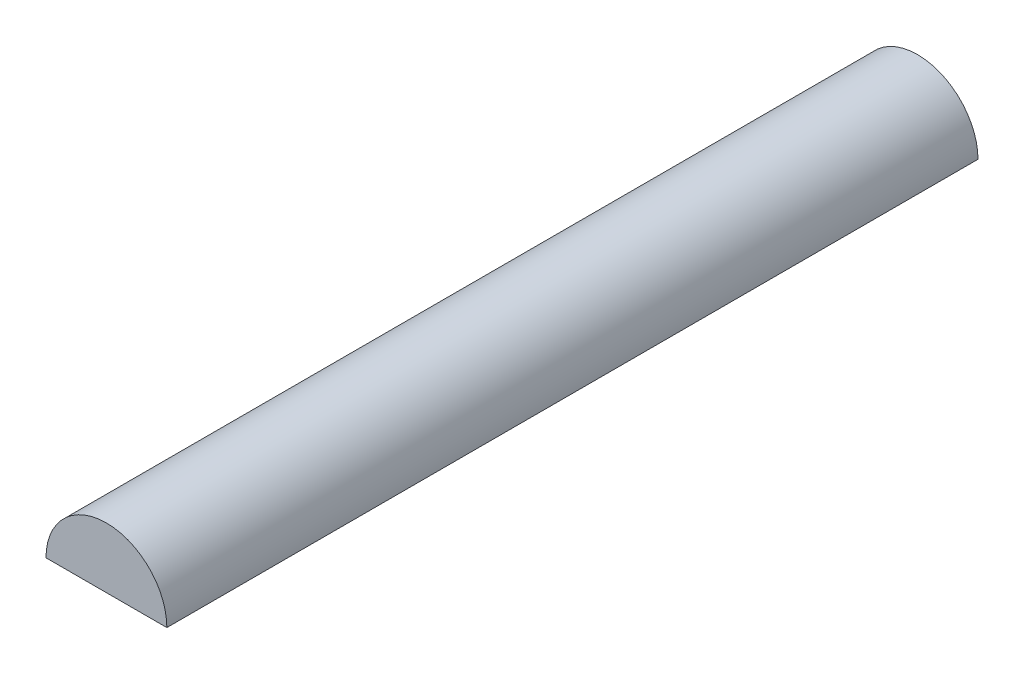
ISO-10303-21;
HEADER;
FILE_DESCRIPTION(('STEP AP214'),'2;1');
FILE_NAME('part.step','',(''),(''),'','','');
FILE_SCHEMA(('AUTOMOTIVE_DESIGN { 1 0 10303 214 1 1 1 1 }'));
ENDSEC;
DATA;
#1=APPLICATION_CONTEXT('core data for automotive mechanical design processes');
#2=APPLICATION_PROTOCOL_DEFINITION('international standard','automotive_design',2000,#1);
#3=PRODUCT_CONTEXT('',#1,'mechanical');
#4=PRODUCT('Part','Part','',(#3));
#5=PRODUCT_RELATED_PRODUCT_CATEGORY('part','',(#4));
#6=PRODUCT_DEFINITION_FORMATION('','',#4);
#7=PRODUCT_DEFINITION_CONTEXT('part definition',#1,'design');
#8=PRODUCT_DEFINITION('design','',#6,#7);
#9=PRODUCT_DEFINITION_SHAPE('','',#8);
#10=(LENGTH_UNIT() NAMED_UNIT(*) SI_UNIT(.MILLI.,.METRE.));
#11=(NAMED_UNIT(*) PLANE_ANGLE_UNIT() SI_UNIT($,.RADIAN.));
#12=(NAMED_UNIT(*) SI_UNIT($,.STERADIAN.) SOLID_ANGLE_UNIT());
#13=UNCERTAINTY_MEASURE_WITH_UNIT(LENGTH_MEASURE(1.E-05),#10,'distance_accuracy_value','');
#14=(GEOMETRIC_REPRESENTATION_CONTEXT(3) GLOBAL_UNCERTAINTY_ASSIGNED_CONTEXT((#13)) GLOBAL_UNIT_ASSIGNED_CONTEXT((#10,
#11,#12)) REPRESENTATION_CONTEXT('',''));
#15=CARTESIAN_POINT('',(0.,0.,0.));
#16=DIRECTION('',(0.,0.,1.));
#17=DIRECTION('',(1.,0.,0.));
#18=AXIS2_PLACEMENT_3D('',#15,#16,#17);
#19=CARTESIAN_POINT('',(0.,0.,10.));
#20=DIRECTION('',(0.,0.,-1.));
#21=DIRECTION('',(-1.,0.,0.));
#22=AXIS2_PLACEMENT_3D('',#19,#20,#21);
#23=CYLINDRICAL_SURFACE('',#22,0.744999999999999);
#24=CARTESIAN_POINT('',(0.,0.,0.));
#25=DIRECTION('',(0.,0.,1.));
#26=DIRECTION('',(-1.,0.,0.));
#27=AXIS2_PLACEMENT_3D('',#24,#25,#26);
#28=CIRCLE('',#27,0.744999999999999);
#29=CARTESIAN_POINT('',(0.744999999999999,0.,0.));
#30=VERTEX_POINT('',#29);
#31=CARTESIAN_POINT('',(-0.744999999999999,0.,0.));
#32=VERTEX_POINT('',#31);
#33=EDGE_CURVE('E69',#30,#32,#28,.T.);
#34=ORIENTED_EDGE('',*,*,#33,.T.);
#35=DIRECTION('',(0.,0.,-1.));
#36=VECTOR('',#35,1.);
#37=CARTESIAN_POINT('',(-0.744999999999999,0.,10.));
#38=LINE('',#37,#36);
#39=CARTESIAN_POINT('',(-0.744999999999999,0.,10.));
#40=VERTEX_POINT('',#39);
#41=EDGE_CURVE('E12',#40,#32,#38,.T.);
#42=ORIENTED_EDGE('',*,*,#41,.F.);
#43=CARTESIAN_POINT('',(0.,0.,10.));
#44=DIRECTION('',(0.,0.,1.));
#45=DIRECTION('',(-1.,0.,0.));
#46=AXIS2_PLACEMENT_3D('',#43,#44,#45);
#47=CIRCLE('',#46,0.744999999999999);
#48=CARTESIAN_POINT('',(0.744999999999999,0.,10.));
#49=VERTEX_POINT('',#48);
#50=EDGE_CURVE('E71',#49,#40,#47,.T.);
#51=ORIENTED_EDGE('',*,*,#50,.F.);
#52=DIRECTION('',(0.,0.,-1.));
#53=VECTOR('',#52,1.);
#54=CARTESIAN_POINT('',(0.744999999999999,0.,10.));
#55=LINE('',#54,#53);
#56=EDGE_CURVE('E49',#49,#30,#55,.T.);
#57=ORIENTED_EDGE('',*,*,#56,.T.);
#58=EDGE_LOOP('',(#34,#42,#51,#57));
#59=FACE_BOUND('',#58,.T.);
#60=ADVANCED_FACE('F42',(#59),#23,.T.);
#61=CARTESIAN_POINT('',(-0.744999999999999,0.,10.));
#62=DIRECTION('',(0.,1.,0.));
#63=DIRECTION('',(0.,0.,1.));
#64=AXIS2_PLACEMENT_3D('',#61,#62,#63);
#65=PLANE('',#64);
#66=DIRECTION('',(1.,0.,0.));
#67=VECTOR('',#66,1.);
#68=CARTESIAN_POINT('',(-0.744999999999999,0.,0.));
#69=LINE('',#68,#67);
#70=EDGE_CURVE('E66',#32,#30,#69,.T.);
#71=ORIENTED_EDGE('',*,*,#70,.T.);
#72=ORIENTED_EDGE('',*,*,#56,.F.);
#73=DIRECTION('',(1.,0.,0.));
#74=VECTOR('',#73,1.);
#75=CARTESIAN_POINT('',(-0.744999999999999,0.,10.));
#76=LINE('',#75,#74);
#77=EDGE_CURVE('E55',#40,#49,#76,.T.);
#78=ORIENTED_EDGE('',*,*,#77,.F.);
#79=ORIENTED_EDGE('',*,*,#41,.T.);
#80=EDGE_LOOP('',(#71,#72,#78,#79));
#81=FACE_BOUND('',#80,.T.);
#82=ADVANCED_FACE('F74',(#81),#65,.F.);
#83=CARTESIAN_POINT('',(0.,0.,10.));
#84=DIRECTION('',(0.,0.,-1.));
#85=DIRECTION('',(-1.,0.,0.));
#86=AXIS2_PLACEMENT_3D('',#83,#84,#85);
#87=PLANE('',#86);
#88=ORIENTED_EDGE('',*,*,#50,.T.);
#89=ORIENTED_EDGE('',*,*,#77,.T.);
#90=EDGE_LOOP('',(#88,#89));
#91=FACE_BOUND('',#90,.T.);
#92=ADVANCED_FACE('F80',(#91),#87,.F.);
#93=CARTESIAN_POINT('',(0.,0.,0.));
#94=DIRECTION('',(0.,0.,-1.));
#95=DIRECTION('',(-1.,0.,0.));
#96=AXIS2_PLACEMENT_3D('',#93,#94,#95);
#97=PLANE('',#96);
#98=ORIENTED_EDGE('',*,*,#33,.F.);
#99=ORIENTED_EDGE('',*,*,#70,.F.);
#100=EDGE_LOOP('',(#98,#99));
#101=FACE_BOUND('',#100,.T.);
#102=ADVANCED_FACE('F67',(#101),#97,.T.);
#103=CLOSED_SHELL('',(#60,#82,#92,#102));
#104=MANIFOLD_SOLID_BREP('B2',#103);
#105=ADVANCED_BREP_SHAPE_REPRESENTATION('',(#18,#104),#14);
#106=SHAPE_DEFINITION_REPRESENTATION(#9,#105);
ENDSEC;
END-ISO-10303-21;
